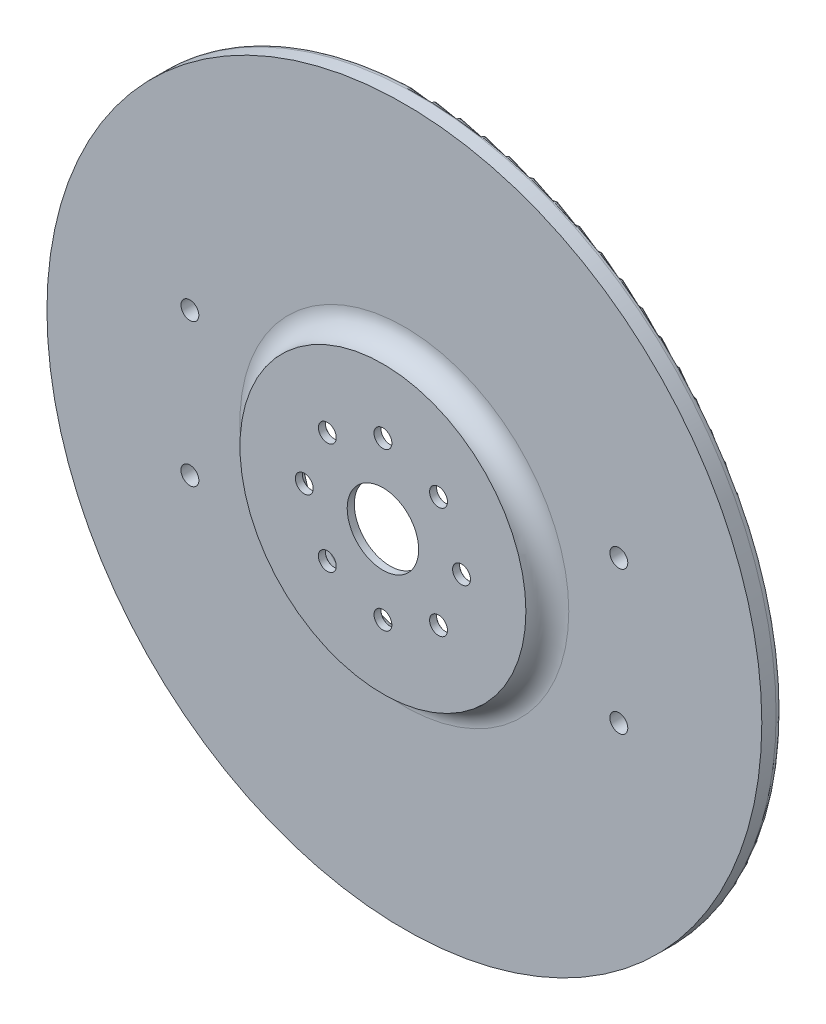
ISO-10303-21;
HEADER;
FILE_DESCRIPTION(('STEP AP214'),'2;1');
FILE_NAME('part.step','',(''),(''),'','','');
FILE_SCHEMA(('AUTOMOTIVE_DESIGN { 1 0 10303 214 1 1 1 1 }'));
ENDSEC;
DATA;
#1=APPLICATION_CONTEXT('core data for automotive mechanical design processes');
#2=APPLICATION_PROTOCOL_DEFINITION('international standard','automotive_design',2000,#1);
#3=PRODUCT_CONTEXT('',#1,'mechanical');
#4=PRODUCT('Part','Part','',(#3));
#5=PRODUCT_RELATED_PRODUCT_CATEGORY('part','',(#4));
#6=PRODUCT_DEFINITION_FORMATION('','',#4);
#7=PRODUCT_DEFINITION_CONTEXT('part definition',#1,'design');
#8=PRODUCT_DEFINITION('design','',#6,#7);
#9=PRODUCT_DEFINITION_SHAPE('','',#8);
#10=(LENGTH_UNIT() NAMED_UNIT(*) SI_UNIT(.MILLI.,.METRE.));
#11=(NAMED_UNIT(*) PLANE_ANGLE_UNIT() SI_UNIT($,.RADIAN.));
#12=(NAMED_UNIT(*) SI_UNIT($,.STERADIAN.) SOLID_ANGLE_UNIT());
#13=UNCERTAINTY_MEASURE_WITH_UNIT(LENGTH_MEASURE(1.E-05),#10,'distance_accuracy_value','');
#14=(GEOMETRIC_REPRESENTATION_CONTEXT(3) GLOBAL_UNCERTAINTY_ASSIGNED_CONTEXT((#13)) GLOBAL_UNIT_ASSIGNED_CONTEXT((#10,
#11,#12)) REPRESENTATION_CONTEXT('',''));
#15=CARTESIAN_POINT('',(0.,0.,0.));
#16=DIRECTION('',(0.,0.,1.));
#17=DIRECTION('',(1.,0.,0.));
#18=AXIS2_PLACEMENT_3D('',#15,#16,#17);
#19=CARTESIAN_POINT('',(0.,0.,3.));
#20=DIRECTION('',(0.,0.,-1.));
#21=DIRECTION('',(-1.,0.,0.));
#22=AXIS2_PLACEMENT_3D('',#19,#20,#21);
#23=CYLINDRICAL_SURFACE('',#22,50.);
#24=CARTESIAN_POINT('',(0.,0.,1.));
#25=DIRECTION('',(0.,0.,1.));
#26=DIRECTION('',(1.,0.,0.));
#27=AXIS2_PLACEMENT_3D('',#24,#25,#26);
#28=CIRCLE('',#27,50.);
#29=CARTESIAN_POINT('',(50.,0.,1.));
#30=VERTEX_POINT('',#29);
#31=EDGE_CURVE('E83',#30,#30,#28,.T.);
#32=ORIENTED_EDGE('',*,*,#31,.T.);
#33=EDGE_LOOP('',(#32));
#34=FACE_BOUND('',#33,.T.);
#35=CARTESIAN_POINT('',(0.,0.,3.));
#36=DIRECTION('',(0.,0.,1.));
#37=DIRECTION('',(1.,0.,0.));
#38=AXIS2_PLACEMENT_3D('',#35,#36,#37);
#39=CIRCLE('',#38,50.);
#40=CARTESIAN_POINT('',(50.,0.,3.));
#41=VERTEX_POINT('',#40);
#42=EDGE_CURVE('E87',#41,#41,#39,.T.);
#43=ORIENTED_EDGE('',*,*,#42,.F.);
#44=EDGE_LOOP('',(#43));
#45=FACE_BOUND('',#44,.T.);
#46=ADVANCED_FACE('F43',(#34,#45),#23,.T.);
#47=CARTESIAN_POINT('',(0.,0.,3.));
#48=DIRECTION('',(0.,0.,1.));
#49=DIRECTION('',(1.,0.,0.));
#50=AXIS2_PLACEMENT_3D('',#47,#48,#49);
#51=PLANE('',#50);
#52=CARTESIAN_POINT('',(0.,0.,3.));
#53=DIRECTION('',(0.,0.,1.));
#54=DIRECTION('',(1.,0.,0.));
#55=AXIS2_PLACEMENT_3D('',#52,#53,#54);
#56=CIRCLE('',#55,23.);
#57=CARTESIAN_POINT('',(23.,0.,3.));
#58=VERTEX_POINT('',#57);
#59=EDGE_CURVE('E10',#58,#58,#56,.F.);
#60=ORIENTED_EDGE('',*,*,#59,.T.);
#61=EDGE_LOOP('',(#60));
#62=FACE_BOUND('',#61,.T.);
#63=CARTESIAN_POINT('',(30.0000000000011,10.,3.));
#64=DIRECTION('',(0.,0.,-1.));
#65=DIRECTION('',(-1.,0.,0.));
#66=AXIS2_PLACEMENT_3D('',#63,#64,#65);
#67=CIRCLE('',#66,1.25);
#68=CARTESIAN_POINT('',(28.7500000000011,10.,3.));
#69=VERTEX_POINT('',#68);
#70=EDGE_CURVE('E115',#69,#69,#67,.T.);
#71=ORIENTED_EDGE('',*,*,#70,.T.);
#72=EDGE_LOOP('',(#71));
#73=FACE_BOUND('',#72,.T.);
#74=CARTESIAN_POINT('',(30.0000000000011,-10.,3.));
#75=DIRECTION('',(0.,0.,-1.));
#76=DIRECTION('',(-1.,0.,0.));
#77=AXIS2_PLACEMENT_3D('',#74,#75,#76);
#78=CIRCLE('',#77,1.25);
#79=CARTESIAN_POINT('',(28.7500000000011,-10.,3.));
#80=VERTEX_POINT('',#79);
#81=EDGE_CURVE('E107',#80,#80,#78,.T.);
#82=ORIENTED_EDGE('',*,*,#81,.T.);
#83=EDGE_LOOP('',(#82));
#84=FACE_BOUND('',#83,.T.);
#85=CARTESIAN_POINT('',(-30.0000000000011,-10.,3.));
#86=DIRECTION('',(0.,0.,-1.));
#87=DIRECTION('',(-1.,0.,0.));
#88=AXIS2_PLACEMENT_3D('',#85,#86,#87);
#89=CIRCLE('',#88,1.25);
#90=CARTESIAN_POINT('',(-31.2500000000011,-10.,3.));
#91=VERTEX_POINT('',#90);
#92=EDGE_CURVE('E99',#91,#91,#89,.T.);
#93=ORIENTED_EDGE('',*,*,#92,.T.);
#94=EDGE_LOOP('',(#93));
#95=FACE_BOUND('',#94,.T.);
#96=CARTESIAN_POINT('',(-30.0000000000011,10.,3.));
#97=DIRECTION('',(0.,0.,-1.));
#98=DIRECTION('',(-1.,0.,0.));
#99=AXIS2_PLACEMENT_3D('',#96,#97,#98);
#100=CIRCLE('',#99,1.25);
#101=CARTESIAN_POINT('',(-31.2500000000011,10.,3.));
#102=VERTEX_POINT('',#101);
#103=EDGE_CURVE('E91',#102,#102,#100,.T.);
#104=ORIENTED_EDGE('',*,*,#103,.T.);
#105=EDGE_LOOP('',(#104));
#106=FACE_BOUND('',#105,.T.);
#107=ORIENTED_EDGE('',*,*,#42,.T.);
#108=EDGE_LOOP('',(#107));
#109=FACE_BOUND('',#108,.T.);
#110=ADVANCED_FACE('F274',(#62,#73,#84,#95,#106,#109),#51,.T.);
#111=CARTESIAN_POINT('',(0.,0.,0.));
#112=DIRECTION('',(0.,0.,1.));
#113=DIRECTION('',(1.,0.,0.));
#114=AXIS2_PLACEMENT_3D('',#111,#112,#113);
#115=PLANE('',#114);
#116=CARTESIAN_POINT('',(0.,0.,0.));
#117=DIRECTION('',(0.,0.,1.));
#118=DIRECTION('',(1.,0.,0.));
#119=AXIS2_PLACEMENT_3D('',#116,#117,#118);
#120=CIRCLE('',#119,49.);
#121=CARTESIAN_POINT('',(49.,0.,0.));
#122=VERTEX_POINT('',#121);
#123=EDGE_CURVE('E56',#122,#122,#120,.F.);
#124=ORIENTED_EDGE('',*,*,#123,.T.);
#125=EDGE_LOOP('',(#124));
#126=FACE_BOUND('',#125,.T.);
#127=CARTESIAN_POINT('',(-30.0000000000011,10.,0.));
#128=DIRECTION('',(0.,0.,1.));
#129=DIRECTION('',(1.,0.,0.));
#130=AXIS2_PLACEMENT_3D('',#127,#128,#129);
#131=CIRCLE('',#130,1.4722048604329);
#132=CARTESIAN_POINT('',(-28.5277951395682,10.,0.));
#133=VERTEX_POINT('',#132);
#134=EDGE_CURVE('E61',#133,#133,#131,.T.);
#135=ORIENTED_EDGE('',*,*,#134,.T.);
#136=EDGE_LOOP('',(#135));
#137=FACE_BOUND('',#136,.T.);
#138=CARTESIAN_POINT('',(-30.0000000000011,-10.,0.));
#139=DIRECTION('',(0.,0.,1.));
#140=DIRECTION('',(1.,0.,0.));
#141=AXIS2_PLACEMENT_3D('',#138,#139,#140);
#142=CIRCLE('',#141,1.4722048604329);
#143=CARTESIAN_POINT('',(-28.5277951395682,-10.,0.));
#144=VERTEX_POINT('',#143);
#145=EDGE_CURVE('E67',#144,#144,#142,.T.);
#146=ORIENTED_EDGE('',*,*,#145,.T.);
#147=EDGE_LOOP('',(#146));
#148=FACE_BOUND('',#147,.T.);
#149=CARTESIAN_POINT('',(30.0000000000011,-10.,0.));
#150=DIRECTION('',(0.,0.,1.));
#151=DIRECTION('',(1.,0.,0.));
#152=AXIS2_PLACEMENT_3D('',#149,#150,#151);
#153=CIRCLE('',#152,1.4722048604329);
#154=CARTESIAN_POINT('',(31.472204860434,-10.,0.));
#155=VERTEX_POINT('',#154);
#156=EDGE_CURVE('E71',#155,#155,#153,.T.);
#157=ORIENTED_EDGE('',*,*,#156,.T.);
#158=EDGE_LOOP('',(#157));
#159=FACE_BOUND('',#158,.T.);
#160=CARTESIAN_POINT('',(30.0000000000011,10.,0.));
#161=DIRECTION('',(0.,0.,1.));
#162=DIRECTION('',(1.,0.,0.));
#163=AXIS2_PLACEMENT_3D('',#160,#161,#162);
#164=CIRCLE('',#163,1.4722048604329);
#165=CARTESIAN_POINT('',(31.472204860434,10.,0.));
#166=VERTEX_POINT('',#165);
#167=EDGE_CURVE('E75',#166,#166,#164,.T.);
#168=ORIENTED_EDGE('',*,*,#167,.T.);
#169=EDGE_LOOP('',(#168));
#170=FACE_BOUND('',#169,.T.);
#171=CARTESIAN_POINT('',(0.,0.,0.));
#172=DIRECTION('',(0.,0.,1.));
#173=DIRECTION('',(1.,0.,0.));
#174=AXIS2_PLACEMENT_3D('',#171,#172,#173);
#175=CIRCLE('',#174,18.);
#176=CARTESIAN_POINT('',(18.,0.,0.));
#177=VERTEX_POINT('',#176);
#178=EDGE_CURVE('E79',#177,#177,#175,.T.);
#179=ORIENTED_EDGE('',*,*,#178,.T.);
#180=EDGE_LOOP('',(#179));
#181=FACE_BOUND('',#180,.T.);
#182=ADVANCED_FACE('F281',(#126,#137,#148,#159,#170,#181),#115,.F.);
#183=CARTESIAN_POINT('',(-30.0000000000011,10.,0.));
#184=DIRECTION('',(0.,0.,-1.));
#185=DIRECTION('',(-1.,0.,0.));
#186=AXIS2_PLACEMENT_3D('',#183,#184,#185);
#187=CYLINDRICAL_SURFACE('',#186,1.25);
#188=ORIENTED_EDGE('',*,*,#103,.F.);
#189=EDGE_LOOP('',(#188));
#190=FACE_BOUND('',#189,.T.);
#191=CARTESIAN_POINT('',(-30.0000000000011,10.,0.0250000000000015));
#192=DIRECTION('',(0.,0.,-1.));
#193=DIRECTION('',(-1.,0.,0.));
#194=AXIS2_PLACEMENT_3D('',#191,#192,#193);
#195=CIRCLE('',#194,1.25);
#196=CARTESIAN_POINT('',(-31.2500000000011,10.,0.0250000000000015));
#197=VERTEX_POINT('',#196);
#198=EDGE_CURVE('E95',#197,#197,#195,.T.);
#199=ORIENTED_EDGE('',*,*,#198,.T.);
#200=EDGE_LOOP('',(#199));
#201=FACE_BOUND('',#200,.T.);
#202=ADVANCED_FACE('F314',(#190,#201),#187,.F.);
#203=CARTESIAN_POINT('',(-30.0000000000011,-10.,0.));
#204=DIRECTION('',(0.,0.,-1.));
#205=DIRECTION('',(-1.,0.,0.));
#206=AXIS2_PLACEMENT_3D('',#203,#204,#205);
#207=CYLINDRICAL_SURFACE('',#206,1.25);
#208=ORIENTED_EDGE('',*,*,#92,.F.);
#209=EDGE_LOOP('',(#208));
#210=FACE_BOUND('',#209,.T.);
#211=CARTESIAN_POINT('',(-30.0000000000011,-10.,0.0250000000000015));
#212=DIRECTION('',(0.,0.,-1.));
#213=DIRECTION('',(-1.,0.,0.));
#214=AXIS2_PLACEMENT_3D('',#211,#212,#213);
#215=CIRCLE('',#214,1.25);
#216=CARTESIAN_POINT('',(-31.2500000000011,-10.,0.0250000000000015));
#217=VERTEX_POINT('',#216);
#218=EDGE_CURVE('E103',#217,#217,#215,.T.);
#219=ORIENTED_EDGE('',*,*,#218,.T.);
#220=EDGE_LOOP('',(#219));
#221=FACE_BOUND('',#220,.T.);
#222=ADVANCED_FACE('F319',(#210,#221),#207,.F.);
#223=CARTESIAN_POINT('',(30.0000000000011,-10.,0.));
#224=DIRECTION('',(0.,0.,-1.));
#225=DIRECTION('',(-1.,0.,0.));
#226=AXIS2_PLACEMENT_3D('',#223,#224,#225);
#227=CYLINDRICAL_SURFACE('',#226,1.25);
#228=ORIENTED_EDGE('',*,*,#81,.F.);
#229=EDGE_LOOP('',(#228));
#230=FACE_BOUND('',#229,.T.);
#231=CARTESIAN_POINT('',(30.0000000000011,-10.,0.0250000000000015));
#232=DIRECTION('',(0.,0.,-1.));
#233=DIRECTION('',(-1.,0.,0.));
#234=AXIS2_PLACEMENT_3D('',#231,#232,#233);
#235=CIRCLE('',#234,1.25);
#236=CARTESIAN_POINT('',(28.7500000000011,-10.,0.0250000000000015));
#237=VERTEX_POINT('',#236);
#238=EDGE_CURVE('E111',#237,#237,#235,.T.);
#239=ORIENTED_EDGE('',*,*,#238,.T.);
#240=EDGE_LOOP('',(#239));
#241=FACE_BOUND('',#240,.T.);
#242=ADVANCED_FACE('F335',(#230,#241),#227,.F.);
#243=CARTESIAN_POINT('',(30.0000000000011,10.,0.));
#244=DIRECTION('',(0.,0.,-1.));
#245=DIRECTION('',(-1.,0.,0.));
#246=AXIS2_PLACEMENT_3D('',#243,#244,#245);
#247=CYLINDRICAL_SURFACE('',#246,1.25);
#248=ORIENTED_EDGE('',*,*,#70,.F.);
#249=EDGE_LOOP('',(#248));
#250=FACE_BOUND('',#249,.T.);
#251=CARTESIAN_POINT('',(30.0000000000011,10.,0.0250000000000015));
#252=DIRECTION('',(0.,0.,-1.));
#253=DIRECTION('',(-1.,0.,0.));
#254=AXIS2_PLACEMENT_3D('',#251,#252,#253);
#255=CIRCLE('',#254,1.25);
#256=CARTESIAN_POINT('',(28.7500000000011,10.,0.0250000000000015));
#257=VERTEX_POINT('',#256);
#258=EDGE_CURVE('E119',#257,#257,#255,.T.);
#259=ORIENTED_EDGE('',*,*,#258,.T.);
#260=EDGE_LOOP('',(#259));
#261=FACE_BOUND('',#260,.T.);
#262=ADVANCED_FACE('F270',(#250,#261),#247,.F.);
#263=CARTESIAN_POINT('',(0.,0.,6.));
#264=DIRECTION('',(0.,0.,1.));
#265=DIRECTION('',(1.,0.,0.));
#266=AXIS2_PLACEMENT_3D('',#263,#264,#265);
#267=PLANE('',#266);
#268=CARTESIAN_POINT('',(0.,0.,6.));
#269=DIRECTION('',(0.,0.,1.));
#270=DIRECTION('',(1.,0.,0.));
#271=AXIS2_PLACEMENT_3D('',#268,#269,#270);
#272=CIRCLE('',#271,5.);
#273=CARTESIAN_POINT('',(5.,0.,6.));
#274=VERTEX_POINT('',#273);
#275=EDGE_CURVE('E227',#274,#274,#272,.T.);
#276=ORIENTED_EDGE('',*,*,#275,.F.);
#277=EDGE_LOOP('',(#276));
#278=FACE_BOUND('',#277,.T.);
#279=CARTESIAN_POINT('',(11.,-3.67414246416392E-11,6.));
#280=DIRECTION('',(0.,0.,-1.));
#281=DIRECTION('',(-1.,0.,0.));
#282=AXIS2_PLACEMENT_3D('',#279,#280,#281);
#283=CIRCLE('',#282,1.25);
#284=CARTESIAN_POINT('',(9.75,-3.67414246416392E-11,6.));
#285=VERTEX_POINT('',#284);
#286=EDGE_CURVE('E215',#285,#285,#283,.T.);
#287=ORIENTED_EDGE('',*,*,#286,.T.);
#288=EDGE_LOOP('',(#287));
#289=FACE_BOUND('',#288,.T.);
#290=CARTESIAN_POINT('',(7.77817459307799,7.77817459302605,6.));
#291=DIRECTION('',(0.,0.,-1.));
#292=DIRECTION('',(-1.,0.,0.));
#293=AXIS2_PLACEMENT_3D('',#290,#291,#292);
#294=CIRCLE('',#293,1.25);
#295=CARTESIAN_POINT('',(6.52817459307799,7.77817459302605,6.));
#296=VERTEX_POINT('',#295);
#297=EDGE_CURVE('E203',#296,#296,#294,.T.);
#298=ORIENTED_EDGE('',*,*,#297,.T.);
#299=EDGE_LOOP('',(#298));
#300=FACE_BOUND('',#299,.T.);
#301=CARTESIAN_POINT('',(3.67030183469119E-11,11.,6.));
#302=DIRECTION('',(0.,0.,-1.));
#303=DIRECTION('',(-1.,0.,0.));
#304=AXIS2_PLACEMENT_3D('',#301,#302,#303);
#305=CIRCLE('',#304,1.25);
#306=CARTESIAN_POINT('',(-1.2499999999633,11.,6.));
#307=VERTEX_POINT('',#306);
#308=EDGE_CURVE('E191',#307,#307,#305,.T.);
#309=ORIENTED_EDGE('',*,*,#308,.T.);
#310=EDGE_LOOP('',(#309));
#311=FACE_BOUND('',#310,.T.);
#312=CARTESIAN_POINT('',(-7.77817459302608,7.77817459307796,6.));
#313=DIRECTION('',(0.,0.,-1.));
#314=DIRECTION('',(-1.,0.,0.));
#315=AXIS2_PLACEMENT_3D('',#312,#313,#314);
#316=CIRCLE('',#315,1.25);
#317=CARTESIAN_POINT('',(-9.02817459302608,7.77817459307796,6.));
#318=VERTEX_POINT('',#317);
#319=EDGE_CURVE('E179',#318,#318,#316,.T.);
#320=ORIENTED_EDGE('',*,*,#319,.T.);
#321=EDGE_LOOP('',(#320));
#322=FACE_BOUND('',#321,.T.);
#323=CARTESIAN_POINT('',(-11.,3.66646120521846E-11,6.));
#324=DIRECTION('',(0.,0.,-1.));
#325=DIRECTION('',(-1.,0.,0.));
#326=AXIS2_PLACEMENT_3D('',#323,#324,#325);
#327=CIRCLE('',#326,1.25);
#328=CARTESIAN_POINT('',(-12.25,3.66646120521846E-11,6.));
#329=VERTEX_POINT('',#328);
#330=EDGE_CURVE('E167',#329,#329,#327,.T.);
#331=ORIENTED_EDGE('',*,*,#330,.T.);
#332=EDGE_LOOP('',(#331));
#333=FACE_BOUND('',#332,.T.);
#334=CARTESIAN_POINT('',(-7.77817459307793,-7.77817459302611,6.));
#335=DIRECTION('',(0.,0.,-1.));
#336=DIRECTION('',(-1.,0.,0.));
#337=AXIS2_PLACEMENT_3D('',#334,#335,#336);
#338=CIRCLE('',#337,1.25);
#339=CARTESIAN_POINT('',(-9.02817459307793,-7.77817459302611,6.));
#340=VERTEX_POINT('',#339);
#341=EDGE_CURVE('E155',#340,#340,#338,.T.);
#342=ORIENTED_EDGE('',*,*,#341,.T.);
#343=EDGE_LOOP('',(#342));
#344=FACE_BOUND('',#343,.T.);
#345=CARTESIAN_POINT('',(-3.66262057574574E-11,-11.,6.));
#346=DIRECTION('',(0.,0.,-1.));
#347=DIRECTION('',(-1.,0.,0.));
#348=AXIS2_PLACEMENT_3D('',#345,#346,#347);
#349=CIRCLE('',#348,1.25);
#350=CARTESIAN_POINT('',(-1.25000000003663,-11.,6.));
#351=VERTEX_POINT('',#350);
#352=EDGE_CURVE('E143',#351,#351,#349,.T.);
#353=ORIENTED_EDGE('',*,*,#352,.T.);
#354=EDGE_LOOP('',(#353));
#355=FACE_BOUND('',#354,.T.);
#356=CARTESIAN_POINT('',(7.77817459302614,-7.77817459307791,6.));
#357=DIRECTION('',(0.,0.,-1.));
#358=DIRECTION('',(-1.,0.,0.));
#359=AXIS2_PLACEMENT_3D('',#356,#357,#358);
#360=CIRCLE('',#359,1.25);
#361=CARTESIAN_POINT('',(6.52817459302614,-7.77817459307791,6.));
#362=VERTEX_POINT('',#361);
#363=EDGE_CURVE('E131',#362,#362,#360,.T.);
#364=ORIENTED_EDGE('',*,*,#363,.T.);
#365=EDGE_LOOP('',(#364));
#366=FACE_BOUND('',#365,.T.);
#367=CARTESIAN_POINT('',(0.,0.,6.));
#368=DIRECTION('',(0.,0.,1.));
#369=DIRECTION('',(1.,0.,0.));
#370=AXIS2_PLACEMENT_3D('',#367,#368,#369);
#371=CIRCLE('',#370,20.);
#372=CARTESIAN_POINT('',(20.,0.,6.));
#373=VERTEX_POINT('',#372);
#374=EDGE_CURVE('E123',#373,#373,#371,.T.);
#375=ORIENTED_EDGE('',*,*,#374,.T.);
#376=EDGE_LOOP('',(#375));
#377=FACE_BOUND('',#376,.T.);
#378=ADVANCED_FACE('F263',(#278,#289,#300,#311,#322,#333,#344,#355,#366,#377),#267,.T.);
#379=CARTESIAN_POINT('',(0.,0.,5.));
#380=DIRECTION('',(0.,0.,-1.));
#381=DIRECTION('',(-1.,0.,0.));
#382=AXIS2_PLACEMENT_3D('',#379,#380,#381);
#383=CYLINDRICAL_SURFACE('',#382,17.);
#384=CARTESIAN_POINT('',(0.,0.,1.));
#385=DIRECTION('',(0.,0.,1.));
#386=DIRECTION('',(1.,0.,0.));
#387=AXIS2_PLACEMENT_3D('',#384,#385,#386);
#388=CIRCLE('',#387,17.);
#389=CARTESIAN_POINT('',(17.,0.,1.));
#390=VERTEX_POINT('',#389);
#391=EDGE_CURVE('E51',#390,#390,#388,.F.);
#392=ORIENTED_EDGE('',*,*,#391,.T.);
#393=EDGE_LOOP('',(#392));
#394=FACE_BOUND('',#393,.T.);
#395=CARTESIAN_POINT('',(0.,0.,5.));
#396=DIRECTION('',(0.,0.,-1.));
#397=DIRECTION('',(-1.,0.,0.));
#398=AXIS2_PLACEMENT_3D('',#395,#396,#397);
#399=CIRCLE('',#398,17.);
#400=CARTESIAN_POINT('',(-17.,0.,5.));
#401=VERTEX_POINT('',#400);
#402=EDGE_CURVE('E127',#401,#401,#399,.T.);
#403=ORIENTED_EDGE('',*,*,#402,.F.);
#404=EDGE_LOOP('',(#403));
#405=FACE_BOUND('',#404,.T.);
#406=ADVANCED_FACE('F242',(#394,#405),#383,.F.);
#407=CARTESIAN_POINT('',(0.,0.,5.));
#408=DIRECTION('',(0.,0.,-1.));
#409=DIRECTION('',(-1.,0.,0.));
#410=AXIS2_PLACEMENT_3D('',#407,#408,#409);
#411=PLANE('',#410);
#412=CARTESIAN_POINT('',(0.,0.,5.));
#413=DIRECTION('',(0.,0.,-1.));
#414=DIRECTION('',(-1.,0.,0.));
#415=AXIS2_PLACEMENT_3D('',#412,#413,#414);
#416=CIRCLE('',#415,5.);
#417=CARTESIAN_POINT('',(-5.,0.,5.));
#418=VERTEX_POINT('',#417);
#419=EDGE_CURVE('E231',#418,#418,#416,.T.);
#420=ORIENTED_EDGE('',*,*,#419,.F.);
#421=EDGE_LOOP('',(#420));
#422=FACE_BOUND('',#421,.T.);
#423=CARTESIAN_POINT('',(11.,-3.67414246416392E-11,5.));
#424=DIRECTION('',(0.,0.,-1.));
#425=DIRECTION('',(-1.,0.,0.));
#426=AXIS2_PLACEMENT_3D('',#423,#424,#425);
#427=CIRCLE('',#426,1.275);
#428=CARTESIAN_POINT('',(9.725,-3.67414246416392E-11,5.));
#429=VERTEX_POINT('',#428);
#430=EDGE_CURVE('E223',#429,#429,#427,.T.);
#431=ORIENTED_EDGE('',*,*,#430,.F.);
#432=EDGE_LOOP('',(#431));
#433=FACE_BOUND('',#432,.T.);
#434=CARTESIAN_POINT('',(7.77817459307799,7.77817459302605,5.));
#435=DIRECTION('',(0.,0.,-1.));
#436=DIRECTION('',(-1.,0.,0.));
#437=AXIS2_PLACEMENT_3D('',#434,#435,#436);
#438=CIRCLE('',#437,1.275);
#439=CARTESIAN_POINT('',(6.50317459307799,7.77817459302605,5.));
#440=VERTEX_POINT('',#439);
#441=EDGE_CURVE('E211',#440,#440,#438,.T.);
#442=ORIENTED_EDGE('',*,*,#441,.F.);
#443=EDGE_LOOP('',(#442));
#444=FACE_BOUND('',#443,.T.);
#445=CARTESIAN_POINT('',(3.67030183469119E-11,11.,5.));
#446=DIRECTION('',(0.,0.,-1.));
#447=DIRECTION('',(-1.,0.,0.));
#448=AXIS2_PLACEMENT_3D('',#445,#446,#447);
#449=CIRCLE('',#448,1.275);
#450=CARTESIAN_POINT('',(-1.2749999999633,11.,5.));
#451=VERTEX_POINT('',#450);
#452=EDGE_CURVE('E199',#451,#451,#449,.T.);
#453=ORIENTED_EDGE('',*,*,#452,.F.);
#454=EDGE_LOOP('',(#453));
#455=FACE_BOUND('',#454,.T.);
#456=CARTESIAN_POINT('',(-7.77817459302608,7.77817459307796,5.));
#457=DIRECTION('',(0.,0.,-1.));
#458=DIRECTION('',(-1.,0.,0.));
#459=AXIS2_PLACEMENT_3D('',#456,#457,#458);
#460=CIRCLE('',#459,1.275);
#461=CARTESIAN_POINT('',(-9.05317459302608,7.77817459307796,5.));
#462=VERTEX_POINT('',#461);
#463=EDGE_CURVE('E187',#462,#462,#460,.T.);
#464=ORIENTED_EDGE('',*,*,#463,.F.);
#465=EDGE_LOOP('',(#464));
#466=FACE_BOUND('',#465,.T.);
#467=CARTESIAN_POINT('',(-11.,3.66646120521846E-11,5.));
#468=DIRECTION('',(0.,0.,-1.));
#469=DIRECTION('',(-1.,0.,0.));
#470=AXIS2_PLACEMENT_3D('',#467,#468,#469);
#471=CIRCLE('',#470,1.275);
#472=CARTESIAN_POINT('',(-12.275,3.66646120521846E-11,5.));
#473=VERTEX_POINT('',#472);
#474=EDGE_CURVE('E175',#473,#473,#471,.T.);
#475=ORIENTED_EDGE('',*,*,#474,.F.);
#476=EDGE_LOOP('',(#475));
#477=FACE_BOUND('',#476,.T.);
#478=CARTESIAN_POINT('',(-7.77817459307793,-7.77817459302611,5.));
#479=DIRECTION('',(0.,0.,-1.));
#480=DIRECTION('',(-1.,0.,0.));
#481=AXIS2_PLACEMENT_3D('',#478,#479,#480);
#482=CIRCLE('',#481,1.275);
#483=CARTESIAN_POINT('',(-9.05317459307793,-7.77817459302611,5.));
#484=VERTEX_POINT('',#483);
#485=EDGE_CURVE('E163',#484,#484,#482,.T.);
#486=ORIENTED_EDGE('',*,*,#485,.F.);
#487=EDGE_LOOP('',(#486));
#488=FACE_BOUND('',#487,.T.);
#489=CARTESIAN_POINT('',(-3.66262057574574E-11,-11.,5.));
#490=DIRECTION('',(0.,0.,-1.));
#491=DIRECTION('',(-1.,0.,0.));
#492=AXIS2_PLACEMENT_3D('',#489,#490,#491);
#493=CIRCLE('',#492,1.275);
#494=CARTESIAN_POINT('',(-1.27500000003663,-11.,5.));
#495=VERTEX_POINT('',#494);
#496=EDGE_CURVE('E151',#495,#495,#493,.T.);
#497=ORIENTED_EDGE('',*,*,#496,.F.);
#498=EDGE_LOOP('',(#497));
#499=FACE_BOUND('',#498,.T.);
#500=CARTESIAN_POINT('',(7.77817459302614,-7.77817459307791,5.));
#501=DIRECTION('',(0.,0.,-1.));
#502=DIRECTION('',(-1.,0.,0.));
#503=AXIS2_PLACEMENT_3D('',#500,#501,#502);
#504=CIRCLE('',#503,1.275);
#505=CARTESIAN_POINT('',(6.50317459302614,-7.77817459307791,5.));
#506=VERTEX_POINT('',#505);
#507=EDGE_CURVE('E139',#506,#506,#504,.T.);
#508=ORIENTED_EDGE('',*,*,#507,.F.);
#509=EDGE_LOOP('',(#508));
#510=FACE_BOUND('',#509,.T.);
#511=ORIENTED_EDGE('',*,*,#402,.T.);
#512=EDGE_LOOP('',(#511));
#513=FACE_BOUND('',#512,.T.);
#514=ADVANCED_FACE('F238',(#422,#433,#444,#455,#466,#477,#488,#499,#510,#513),#411,.T.);
#515=CARTESIAN_POINT('',(7.77817459302614,-7.77817459307791,5.));
#516=DIRECTION('',(0.,0.,-1.));
#517=DIRECTION('',(-1.,0.,0.));
#518=AXIS2_PLACEMENT_3D('',#515,#516,#517);
#519=CYLINDRICAL_SURFACE('',#518,1.24999999999999);
#520=ORIENTED_EDGE('',*,*,#363,.F.);
#521=EDGE_LOOP('',(#520));
#522=FACE_BOUND('',#521,.T.);
#523=CARTESIAN_POINT('',(7.77817459302614,-7.77817459307791,5.02500000000003));
#524=DIRECTION('',(0.,0.,-1.));
#525=DIRECTION('',(-1.,0.,0.));
#526=AXIS2_PLACEMENT_3D('',#523,#524,#525);
#527=CIRCLE('',#526,1.24999999999999);
#528=CARTESIAN_POINT('',(6.52817459302615,-7.77817459307791,5.02500000000003));
#529=VERTEX_POINT('',#528);
#530=EDGE_CURVE('E135',#529,#529,#527,.T.);
#531=ORIENTED_EDGE('',*,*,#530,.T.);
#532=EDGE_LOOP('',(#531));
#533=FACE_BOUND('',#532,.T.);
#534=ADVANCED_FACE('F241',(#522,#533),#519,.F.);
#535=CARTESIAN_POINT('',(7.77817459302614,-7.77817459307791,5.));
#536=DIRECTION('',(0.,0.,-1.));
#537=DIRECTION('',(-1.,0.,0.));
#538=AXIS2_PLACEMENT_3D('',#535,#536,#537);
#539=CONICAL_SURFACE('',#538,1.275,0.785398163397136);
#540=ORIENTED_EDGE('',*,*,#530,.F.);
#541=EDGE_LOOP('',(#540));
#542=FACE_BOUND('',#541,.T.);
#543=ORIENTED_EDGE('',*,*,#507,.T.);
#544=EDGE_LOOP('',(#543));
#545=FACE_BOUND('',#544,.T.);
#546=ADVANCED_FACE('F399',(#542,#545),#539,.F.);
#547=CARTESIAN_POINT('',(-3.66262057574574E-11,-11.,5.));
#548=DIRECTION('',(0.,0.,-1.));
#549=DIRECTION('',(-1.,0.,0.));
#550=AXIS2_PLACEMENT_3D('',#547,#548,#549);
#551=CYLINDRICAL_SURFACE('',#550,1.24999999999999);
#552=ORIENTED_EDGE('',*,*,#352,.F.);
#553=EDGE_LOOP('',(#552));
#554=FACE_BOUND('',#553,.T.);
#555=CARTESIAN_POINT('',(-3.66262057574574E-11,-11.,5.02500000000003));
#556=DIRECTION('',(0.,0.,-1.));
#557=DIRECTION('',(-1.,0.,0.));
#558=AXIS2_PLACEMENT_3D('',#555,#556,#557);
#559=CIRCLE('',#558,1.24999999999999);
#560=CARTESIAN_POINT('',(-1.25000000003661,-11.,5.02500000000003));
#561=VERTEX_POINT('',#560);
#562=EDGE_CURVE('E147',#561,#561,#559,.T.);
#563=ORIENTED_EDGE('',*,*,#562,.T.);
#564=EDGE_LOOP('',(#563));
#565=FACE_BOUND('',#564,.T.);
#566=ADVANCED_FACE('F409',(#554,#565),#551,.F.);
#567=CARTESIAN_POINT('',(-3.66262057574574E-11,-11.,5.));
#568=DIRECTION('',(0.,0.,-1.));
#569=DIRECTION('',(-1.,0.,0.));
#570=AXIS2_PLACEMENT_3D('',#567,#568,#569);
#571=CONICAL_SURFACE('',#570,1.275,0.785398163397171);
#572=ORIENTED_EDGE('',*,*,#562,.F.);
#573=EDGE_LOOP('',(#572));
#574=FACE_BOUND('',#573,.T.);
#575=ORIENTED_EDGE('',*,*,#496,.T.);
#576=EDGE_LOOP('',(#575));
#577=FACE_BOUND('',#576,.T.);
#578=ADVANCED_FACE('F419',(#574,#577),#571,.F.);
#579=CARTESIAN_POINT('',(-7.77817459307793,-7.77817459302611,5.));
#580=DIRECTION('',(0.,0.,-1.));
#581=DIRECTION('',(-1.,0.,0.));
#582=AXIS2_PLACEMENT_3D('',#579,#580,#581);
#583=CYLINDRICAL_SURFACE('',#582,1.24999999999999);
#584=ORIENTED_EDGE('',*,*,#341,.F.);
#585=EDGE_LOOP('',(#584));
#586=FACE_BOUND('',#585,.T.);
#587=CARTESIAN_POINT('',(-7.77817459307793,-7.77817459302611,5.02500000000003));
#588=DIRECTION('',(0.,0.,-1.));
#589=DIRECTION('',(-1.,0.,0.));
#590=AXIS2_PLACEMENT_3D('',#587,#588,#589);
#591=CIRCLE('',#590,1.24999999999999);
#592=CARTESIAN_POINT('',(-9.02817459307792,-7.77817459302611,5.02500000000003));
#593=VERTEX_POINT('',#592);
#594=EDGE_CURVE('E159',#593,#593,#591,.T.);
#595=ORIENTED_EDGE('',*,*,#594,.T.);
#596=EDGE_LOOP('',(#595));
#597=FACE_BOUND('',#596,.T.);
#598=ADVANCED_FACE('F429',(#586,#597),#583,.F.);
#599=CARTESIAN_POINT('',(-7.77817459307793,-7.77817459302611,5.));
#600=DIRECTION('',(0.,0.,-1.));
#601=DIRECTION('',(-1.,0.,0.));
#602=AXIS2_PLACEMENT_3D('',#599,#600,#601);
#603=CONICAL_SURFACE('',#602,1.275,0.785398163397171);
#604=ORIENTED_EDGE('',*,*,#594,.F.);
#605=EDGE_LOOP('',(#604));
#606=FACE_BOUND('',#605,.T.);
#607=ORIENTED_EDGE('',*,*,#485,.T.);
#608=EDGE_LOOP('',(#607));
#609=FACE_BOUND('',#608,.T.);
#610=ADVANCED_FACE('F439',(#606,#609),#603,.F.);
#611=CARTESIAN_POINT('',(-11.,3.66646120521846E-11,5.));
#612=DIRECTION('',(0.,0.,-1.));
#613=DIRECTION('',(-1.,0.,0.));
#614=AXIS2_PLACEMENT_3D('',#611,#612,#613);
#615=CYLINDRICAL_SURFACE('',#614,1.24999999999999);
#616=ORIENTED_EDGE('',*,*,#330,.F.);
#617=EDGE_LOOP('',(#616));
#618=FACE_BOUND('',#617,.T.);
#619=CARTESIAN_POINT('',(-11.,3.66646120521846E-11,5.02500000000003));
#620=DIRECTION('',(0.,0.,-1.));
#621=DIRECTION('',(-1.,0.,0.));
#622=AXIS2_PLACEMENT_3D('',#619,#620,#621);
#623=CIRCLE('',#622,1.24999999999999);
#624=CARTESIAN_POINT('',(-12.25,3.66646120521846E-11,5.02500000000003));
#625=VERTEX_POINT('',#624);
#626=EDGE_CURVE('E171',#625,#625,#623,.T.);
#627=ORIENTED_EDGE('',*,*,#626,.T.);
#628=EDGE_LOOP('',(#627));
#629=FACE_BOUND('',#628,.T.);
#630=ADVANCED_FACE('F449',(#618,#629),#615,.F.);
#631=CARTESIAN_POINT('',(-11.,3.66646120521846E-11,5.));
#632=DIRECTION('',(0.,0.,-1.));
#633=DIRECTION('',(-1.,0.,0.));
#634=AXIS2_PLACEMENT_3D('',#631,#632,#633);
#635=CONICAL_SURFACE('',#634,1.275,0.785398163397171);
#636=ORIENTED_EDGE('',*,*,#626,.F.);
#637=EDGE_LOOP('',(#636));
#638=FACE_BOUND('',#637,.T.);
#639=ORIENTED_EDGE('',*,*,#474,.T.);
#640=EDGE_LOOP('',(#639));
#641=FACE_BOUND('',#640,.T.);
#642=ADVANCED_FACE('F459',(#638,#641),#635,.F.);
#643=CARTESIAN_POINT('',(-7.77817459302608,7.77817459307796,5.));
#644=DIRECTION('',(0.,0.,-1.));
#645=DIRECTION('',(-1.,0.,0.));
#646=AXIS2_PLACEMENT_3D('',#643,#644,#645);
#647=CYLINDRICAL_SURFACE('',#646,1.24999999999999);
#648=ORIENTED_EDGE('',*,*,#319,.F.);
#649=EDGE_LOOP('',(#648));
#650=FACE_BOUND('',#649,.T.);
#651=CARTESIAN_POINT('',(-7.77817459302608,7.77817459307796,5.02500000000003));
#652=DIRECTION('',(0.,0.,-1.));
#653=DIRECTION('',(-1.,0.,0.));
#654=AXIS2_PLACEMENT_3D('',#651,#652,#653);
#655=CIRCLE('',#654,1.24999999999999);
#656=CARTESIAN_POINT('',(-9.02817459302607,7.77817459307796,5.02500000000003));
#657=VERTEX_POINT('',#656);
#658=EDGE_CURVE('E183',#657,#657,#655,.T.);
#659=ORIENTED_EDGE('',*,*,#658,.T.);
#660=EDGE_LOOP('',(#659));
#661=FACE_BOUND('',#660,.T.);
#662=ADVANCED_FACE('F469',(#650,#661),#647,.F.);
#663=CARTESIAN_POINT('',(-7.77817459302608,7.77817459307796,5.));
#664=DIRECTION('',(0.,0.,-1.));
#665=DIRECTION('',(-1.,0.,0.));
#666=AXIS2_PLACEMENT_3D('',#663,#664,#665);
#667=CONICAL_SURFACE('',#666,1.275,0.785398163397171);
#668=ORIENTED_EDGE('',*,*,#658,.F.);
#669=EDGE_LOOP('',(#668));
#670=FACE_BOUND('',#669,.T.);
#671=ORIENTED_EDGE('',*,*,#463,.T.);
#672=EDGE_LOOP('',(#671));
#673=FACE_BOUND('',#672,.T.);
#674=ADVANCED_FACE('F479',(#670,#673),#667,.F.);
#675=CARTESIAN_POINT('',(3.67030183469119E-11,11.,5.));
#676=DIRECTION('',(0.,0.,-1.));
#677=DIRECTION('',(-1.,0.,0.));
#678=AXIS2_PLACEMENT_3D('',#675,#676,#677);
#679=CYLINDRICAL_SURFACE('',#678,1.24999999999999);
#680=ORIENTED_EDGE('',*,*,#308,.F.);
#681=EDGE_LOOP('',(#680));
#682=FACE_BOUND('',#681,.T.);
#683=CARTESIAN_POINT('',(3.67030183469119E-11,11.,5.02500000000003));
#684=DIRECTION('',(0.,0.,-1.));
#685=DIRECTION('',(-1.,0.,0.));
#686=AXIS2_PLACEMENT_3D('',#683,#684,#685);
#687=CIRCLE('',#686,1.24999999999999);
#688=CARTESIAN_POINT('',(-1.24999999996328,11.,5.02500000000003));
#689=VERTEX_POINT('',#688);
#690=EDGE_CURVE('E195',#689,#689,#687,.T.);
#691=ORIENTED_EDGE('',*,*,#690,.T.);
#692=EDGE_LOOP('',(#691));
#693=FACE_BOUND('',#692,.T.);
#694=ADVANCED_FACE('F489',(#682,#693),#679,.F.);
#695=CARTESIAN_POINT('',(3.67030183469119E-11,11.,5.));
#696=DIRECTION('',(0.,0.,-1.));
#697=DIRECTION('',(-1.,0.,0.));
#698=AXIS2_PLACEMENT_3D('',#695,#696,#697);
#699=CONICAL_SURFACE('',#698,1.275,0.785398163397171);
#700=ORIENTED_EDGE('',*,*,#690,.F.);
#701=EDGE_LOOP('',(#700));
#702=FACE_BOUND('',#701,.T.);
#703=ORIENTED_EDGE('',*,*,#452,.T.);
#704=EDGE_LOOP('',(#703));
#705=FACE_BOUND('',#704,.T.);
#706=ADVANCED_FACE('F499',(#702,#705),#699,.F.);
#707=CARTESIAN_POINT('',(7.77817459307799,7.77817459302605,5.));
#708=DIRECTION('',(0.,0.,-1.));
#709=DIRECTION('',(-1.,0.,0.));
#710=AXIS2_PLACEMENT_3D('',#707,#708,#709);
#711=CYLINDRICAL_SURFACE('',#710,1.24999999999999);
#712=ORIENTED_EDGE('',*,*,#297,.F.);
#713=EDGE_LOOP('',(#712));
#714=FACE_BOUND('',#713,.T.);
#715=CARTESIAN_POINT('',(7.77817459307799,7.77817459302605,5.02500000000003));
#716=DIRECTION('',(0.,0.,-1.));
#717=DIRECTION('',(-1.,0.,0.));
#718=AXIS2_PLACEMENT_3D('',#715,#716,#717);
#719=CIRCLE('',#718,1.24999999999999);
#720=CARTESIAN_POINT('',(6.528174593078,7.77817459302605,5.02500000000003));
#721=VERTEX_POINT('',#720);
#722=EDGE_CURVE('E207',#721,#721,#719,.T.);
#723=ORIENTED_EDGE('',*,*,#722,.T.);
#724=EDGE_LOOP('',(#723));
#725=FACE_BOUND('',#724,.T.);
#726=ADVANCED_FACE('F509',(#714,#725),#711,.F.);
#727=CARTESIAN_POINT('',(7.77817459307799,7.77817459302605,5.));
#728=DIRECTION('',(0.,0.,-1.));
#729=DIRECTION('',(-1.,0.,0.));
#730=AXIS2_PLACEMENT_3D('',#727,#728,#729);
#731=CONICAL_SURFACE('',#730,1.275,0.785398163397171);
#732=ORIENTED_EDGE('',*,*,#722,.F.);
#733=EDGE_LOOP('',(#732));
#734=FACE_BOUND('',#733,.T.);
#735=ORIENTED_EDGE('',*,*,#441,.T.);
#736=EDGE_LOOP('',(#735));
#737=FACE_BOUND('',#736,.T.);
#738=ADVANCED_FACE('F519',(#734,#737),#731,.F.);
#739=CARTESIAN_POINT('',(11.,-3.67414246416392E-11,5.));
#740=DIRECTION('',(0.,0.,-1.));
#741=DIRECTION('',(-1.,0.,0.));
#742=AXIS2_PLACEMENT_3D('',#739,#740,#741);
#743=CYLINDRICAL_SURFACE('',#742,1.24999999999999);
#744=ORIENTED_EDGE('',*,*,#286,.F.);
#745=EDGE_LOOP('',(#744));
#746=FACE_BOUND('',#745,.T.);
#747=CARTESIAN_POINT('',(11.,-3.67414246416392E-11,5.02500000000003));
#748=DIRECTION('',(0.,0.,-1.));
#749=DIRECTION('',(-1.,0.,0.));
#750=AXIS2_PLACEMENT_3D('',#747,#748,#749);
#751=CIRCLE('',#750,1.24999999999999);
#752=CARTESIAN_POINT('',(9.75000000000001,-3.67414246416392E-11,5.02500000000003));
#753=VERTEX_POINT('',#752);
#754=EDGE_CURVE('E219',#753,#753,#751,.T.);
#755=ORIENTED_EDGE('',*,*,#754,.T.);
#756=EDGE_LOOP('',(#755));
#757=FACE_BOUND('',#756,.T.);
#758=ADVANCED_FACE('F529',(#746,#757),#743,.F.);
#759=CARTESIAN_POINT('',(11.,-3.67414246416392E-11,5.));
#760=DIRECTION('',(0.,0.,-1.));
#761=DIRECTION('',(-1.,0.,0.));
#762=AXIS2_PLACEMENT_3D('',#759,#760,#761);
#763=CONICAL_SURFACE('',#762,1.275,0.785398163397171);
#764=ORIENTED_EDGE('',*,*,#754,.F.);
#765=EDGE_LOOP('',(#764));
#766=FACE_BOUND('',#765,.T.);
#767=ORIENTED_EDGE('',*,*,#430,.T.);
#768=EDGE_LOOP('',(#767));
#769=FACE_BOUND('',#768,.T.);
#770=ADVANCED_FACE('F539',(#766,#769),#763,.F.);
#771=CARTESIAN_POINT('',(0.,0.,10.));
#772=DIRECTION('',(0.,0.,-1.));
#773=DIRECTION('',(-1.,0.,0.));
#774=AXIS2_PLACEMENT_3D('',#771,#772,#773);
#775=CYLINDRICAL_SURFACE('',#774,5.);
#776=ORIENTED_EDGE('',*,*,#275,.T.);
#777=EDGE_LOOP('',(#776));
#778=FACE_BOUND('',#777,.T.);
#779=ORIENTED_EDGE('',*,*,#419,.T.);
#780=EDGE_LOOP('',(#779));
#781=FACE_BOUND('',#780,.T.);
#782=ADVANCED_FACE('F236',(#778,#781),#775,.F.);
#783=CARTESIAN_POINT('',(0.,0.,1.));
#784=DIRECTION('',(0.,0.,1.));
#785=DIRECTION('',(1.,0.,0.));
#786=AXIS2_PLACEMENT_3D('',#783,#784,#785);
#787=TOROIDAL_SURFACE('',#786,49.,1.);
#788=ORIENTED_EDGE('',*,*,#123,.F.);
#789=EDGE_LOOP('',(#788));
#790=FACE_BOUND('',#789,.T.);
#791=ORIENTED_EDGE('',*,*,#31,.F.);
#792=EDGE_LOOP('',(#791));
#793=FACE_BOUND('',#792,.T.);
#794=ADVANCED_FACE('F286',(#790,#793),#787,.T.);
#795=CARTESIAN_POINT('',(-30.0000000000011,10.,1.));
#796=DIRECTION('',(0.,0.,1.));
#797=DIRECTION('',(1.,0.,0.));
#798=AXIS2_PLACEMENT_3D('',#795,#796,#797);
#799=TOROIDAL_SURFACE('',#798,1.4722048604329,1.);
#800=ORIENTED_EDGE('',*,*,#134,.F.);
#801=EDGE_LOOP('',(#800));
#802=FACE_BOUND('',#801,.T.);
#803=ORIENTED_EDGE('',*,*,#198,.F.);
#804=EDGE_LOOP('',(#803));
#805=FACE_BOUND('',#804,.T.);
#806=ADVANCED_FACE('F288',(#802,#805),#799,.T.);
#807=CARTESIAN_POINT('',(-30.0000000000011,-10.,1.));
#808=DIRECTION('',(0.,0.,1.));
#809=DIRECTION('',(1.,0.,0.));
#810=AXIS2_PLACEMENT_3D('',#807,#808,#809);
#811=TOROIDAL_SURFACE('',#810,1.4722048604329,1.);
#812=ORIENTED_EDGE('',*,*,#145,.F.);
#813=EDGE_LOOP('',(#812));
#814=FACE_BOUND('',#813,.T.);
#815=ORIENTED_EDGE('',*,*,#218,.F.);
#816=EDGE_LOOP('',(#815));
#817=FACE_BOUND('',#816,.T.);
#818=ADVANCED_FACE('F292',(#814,#817),#811,.T.);
#819=CARTESIAN_POINT('',(30.0000000000011,-10.,1.));
#820=DIRECTION('',(0.,0.,1.));
#821=DIRECTION('',(1.,0.,0.));
#822=AXIS2_PLACEMENT_3D('',#819,#820,#821);
#823=TOROIDAL_SURFACE('',#822,1.4722048604329,1.);
#824=ORIENTED_EDGE('',*,*,#156,.F.);
#825=EDGE_LOOP('',(#824));
#826=FACE_BOUND('',#825,.T.);
#827=ORIENTED_EDGE('',*,*,#238,.F.);
#828=EDGE_LOOP('',(#827));
#829=FACE_BOUND('',#828,.T.);
#830=ADVANCED_FACE('F296',(#826,#829),#823,.T.);
#831=CARTESIAN_POINT('',(30.0000000000011,10.,1.));
#832=DIRECTION('',(0.,0.,1.));
#833=DIRECTION('',(1.,0.,0.));
#834=AXIS2_PLACEMENT_3D('',#831,#832,#833);
#835=TOROIDAL_SURFACE('',#834,1.4722048604329,1.);
#836=ORIENTED_EDGE('',*,*,#167,.F.);
#837=EDGE_LOOP('',(#836));
#838=FACE_BOUND('',#837,.T.);
#839=ORIENTED_EDGE('',*,*,#258,.F.);
#840=EDGE_LOOP('',(#839));
#841=FACE_BOUND('',#840,.T.);
#842=ADVANCED_FACE('F300',(#838,#841),#835,.T.);
#843=CARTESIAN_POINT('',(0.,0.,1.));
#844=DIRECTION('',(0.,0.,1.));
#845=DIRECTION('',(1.,0.,0.));
#846=AXIS2_PLACEMENT_3D('',#843,#844,#845);
#847=TOROIDAL_SURFACE('',#846,18.,1.);
#848=ORIENTED_EDGE('',*,*,#178,.F.);
#849=EDGE_LOOP('',(#848));
#850=FACE_BOUND('',#849,.T.);
#851=ORIENTED_EDGE('',*,*,#391,.F.);
#852=EDGE_LOOP('',(#851));
#853=FACE_BOUND('',#852,.T.);
#854=ADVANCED_FACE('F303',(#850,#853),#847,.T.);
#855=CARTESIAN_POINT('',(0.,0.,6.));
#856=DIRECTION('',(0.,0.,1.));
#857=DIRECTION('',(1.,0.,0.));
#858=AXIS2_PLACEMENT_3D('',#855,#856,#857);
#859=TOROIDAL_SURFACE('',#858,23.,3.);
#860=ORIENTED_EDGE('',*,*,#59,.F.);
#861=EDGE_LOOP('',(#860));
#862=FACE_BOUND('',#861,.T.);
#863=ORIENTED_EDGE('',*,*,#374,.F.);
#864=EDGE_LOOP('',(#863));
#865=FACE_BOUND('',#864,.T.);
#866=ADVANCED_FACE('F45',(#862,#865),#859,.F.);
#867=CLOSED_SHELL('',(#46,#110,#182,#202,#222,#242,#262,#378,#406,#514,#534,#546,#566,#578,#598,
#610,#630,#642,#662,#674,#694,#706,#726,#738,#758,#770,#782,#794,#806,#818,#830,#842,#854,#866));
#868=MANIFOLD_SOLID_BREP('B2',#867);
#869=ADVANCED_BREP_SHAPE_REPRESENTATION('',(#18,#868),#14);
#870=SHAPE_DEFINITION_REPRESENTATION(#9,#869);
ENDSEC;
END-ISO-10303-21;
